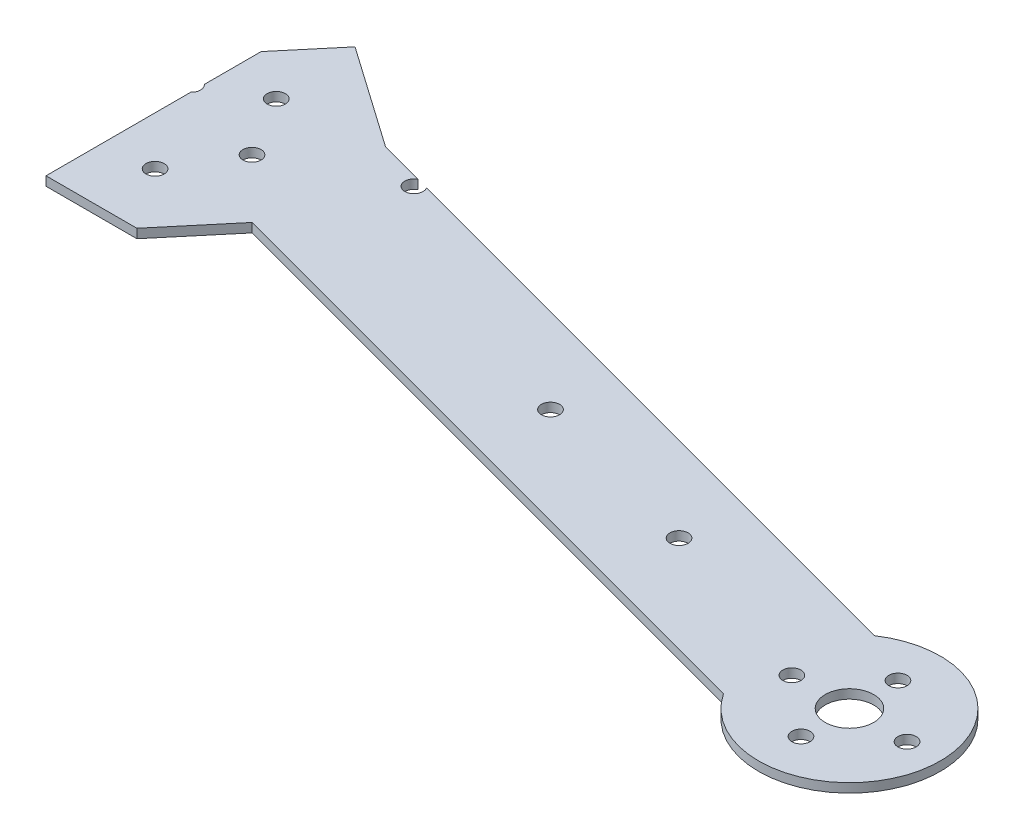
ISO-10303-21;
HEADER;
FILE_DESCRIPTION(('STEP AP214'),'2;1');
FILE_NAME('part.step','',(''),(''),'','','');
FILE_SCHEMA(('AUTOMOTIVE_DESIGN { 1 0 10303 214 1 1 1 1 }'));
ENDSEC;
DATA;
#1=APPLICATION_CONTEXT('core data for automotive mechanical design processes');
#2=APPLICATION_PROTOCOL_DEFINITION('international standard','automotive_design',2000,#1);
#3=PRODUCT_CONTEXT('',#1,'mechanical');
#4=PRODUCT('Part','Part','',(#3));
#5=PRODUCT_RELATED_PRODUCT_CATEGORY('part','',(#4));
#6=PRODUCT_DEFINITION_FORMATION('','',#4);
#7=PRODUCT_DEFINITION_CONTEXT('part definition',#1,'design');
#8=PRODUCT_DEFINITION('design','',#6,#7);
#9=PRODUCT_DEFINITION_SHAPE('','',#8);
#10=(LENGTH_UNIT() NAMED_UNIT(*) SI_UNIT(.MILLI.,.METRE.));
#11=(NAMED_UNIT(*) PLANE_ANGLE_UNIT() SI_UNIT($,.RADIAN.));
#12=(NAMED_UNIT(*) SI_UNIT($,.STERADIAN.) SOLID_ANGLE_UNIT());
#13=UNCERTAINTY_MEASURE_WITH_UNIT(LENGTH_MEASURE(1.E-05),#10,'distance_accuracy_value','');
#14=(GEOMETRIC_REPRESENTATION_CONTEXT(3) GLOBAL_UNCERTAINTY_ASSIGNED_CONTEXT((#13)) GLOBAL_UNIT_ASSIGNED_CONTEXT((#10,
#11,#12)) REPRESENTATION_CONTEXT('',''));
#15=CARTESIAN_POINT('',(0.,0.,0.));
#16=DIRECTION('',(0.,0.,1.));
#17=DIRECTION('',(1.,0.,0.));
#18=AXIS2_PLACEMENT_3D('',#15,#16,#17);
#19=CARTESIAN_POINT('',(23.8632806144762,1.5,38.5929556029831));
#20=DIRECTION('',(0.258773909128812,0.,-0.965937919306512));
#21=DIRECTION('',(-0.965937919306512,0.,-0.258773909128812));
#22=AXIS2_PLACEMENT_3D('',#19,#20,#21);
#23=PLANE('',#22);
#24=DIRECTION('',(0.,1.,0.));
#25=VECTOR('',#24,1.);
#26=CARTESIAN_POINT('',(31.1943125351646,-4.24264068711929,40.5569325316729));
#27=LINE('',#26,#25);
#28=CARTESIAN_POINT('',(31.1943125351646,0.,40.5569325316729));
#29=VERTEX_POINT('',#28);
#30=CARTESIAN_POINT('',(31.1943125351646,1.5,40.5569325316729));
#31=VERTEX_POINT('',#30);
#32=EDGE_CURVE('E12',#29,#31,#27,.T.);
#33=ORIENTED_EDGE('',*,*,#32,.F.);
#34=DIRECTION('',(0.965937919306512,0.,0.258773909128812));
#35=VECTOR('',#34,1.);
#36=CARTESIAN_POINT('',(23.8632806144762,0.,38.5929556029831));
#37=LINE('',#36,#35);
#38=CARTESIAN_POINT('',(23.8632806144762,0.,38.5929556029831));
#39=VERTEX_POINT('',#38);
#40=EDGE_CURVE('E405',#39,#29,#37,.T.);
#41=ORIENTED_EDGE('',*,*,#40,.F.);
#42=DIRECTION('',(0.,-1.,0.));
#43=VECTOR('',#42,1.);
#44=CARTESIAN_POINT('',(23.8632806144762,1.5,38.5929556029831));
#45=LINE('',#44,#43);
#46=CARTESIAN_POINT('',(23.8632806144762,1.5,38.5929556029831));
#47=VERTEX_POINT('',#46);
#48=EDGE_CURVE('E399',#47,#39,#45,.T.);
#49=ORIENTED_EDGE('',*,*,#48,.F.);
#50=DIRECTION('',(0.965937919306512,0.,0.258773909128812));
#51=VECTOR('',#50,1.);
#52=CARTESIAN_POINT('',(23.8632806144762,1.5,38.5929556029831));
#53=LINE('',#52,#51);
#54=EDGE_CURVE('E403',#47,#31,#53,.T.);
#55=ORIENTED_EDGE('',*,*,#54,.T.);
#56=EDGE_LOOP('',(#33,#41,#49,#55));
#57=FACE_BOUND('',#56,.T.);
#58=ADVANCED_FACE('F305',(#57),#23,.T.);
#59=CARTESIAN_POINT('',(-0.999999999999998,1.5,45.7611275320955));
#60=DIRECTION('',(0.,-1.,0.));
#61=DIRECTION('',(0.,0.,-1.));
#62=AXIS2_PLACEMENT_3D('',#59,#60,#61);
#63=PLANE('',#62);
#64=CARTESIAN_POINT('',(75.0359849925505,1.5,62.5434048954609));
#65=DIRECTION('',(0.,1.,0.));
#66=DIRECTION('',(0.,0.,1.));
#67=AXIS2_PLACEMENT_3D('',#64,#65,#66);
#68=CIRCLE('',#67,1.5);
#69=CARTESIAN_POINT('',(75.0359849925505,1.5,64.0434048954609));
#70=VERTEX_POINT('',#69);
#71=EDGE_CURVE('E581',#70,#70,#68,.T.);
#72=ORIENTED_EDGE('',*,*,#71,.F.);
#73=EDGE_LOOP('',(#72));
#74=FACE_BOUND('',#73,.T.);
#75=CARTESIAN_POINT('',(104.014122571746,1.5,70.3066221693253));
#76=DIRECTION('',(0.,1.,0.));
#77=DIRECTION('',(0.,0.,1.));
#78=AXIS2_PLACEMENT_3D('',#75,#76,#77);
#79=CIRCLE('',#78,1.5);
#80=CARTESIAN_POINT('',(104.014122571746,1.5,71.8066221693253));
#81=VERTEX_POINT('',#80);
#82=EDGE_CURVE('E589',#81,#81,#79,.T.);
#83=ORIENTED_EDGE('',*,*,#82,.F.);
#84=EDGE_LOOP('',(#83));
#85=FACE_BOUND('',#84,.T.);
#86=CARTESIAN_POINT('',(142.429473622566,1.5,80.5980605353781));
#87=DIRECTION('',(0.,-1.,0.));
#88=DIRECTION('',(0.,0.,-1.));
#89=AXIS2_PLACEMENT_3D('',#86,#87,#88);
#90=CIRCLE('',#89,3.99999999999999);
#91=CARTESIAN_POINT('',(142.429473622566,1.5,76.5980605353782));
#92=VERTEX_POINT('',#91);
#93=EDGE_CURVE('E536',#92,#92,#90,.T.);
#94=ORIENTED_EDGE('',*,*,#93,.T.);
#95=EDGE_LOOP('',(#94));
#96=FACE_BOUND('',#95,.T.);
#97=CARTESIAN_POINT('',(8.,1.5,60.7611275320955));
#98=DIRECTION('',(0.,-1.,0.));
#99=DIRECTION('',(0.,0.,-1.));
#100=AXIS2_PLACEMENT_3D('',#97,#98,#99);
#101=CIRCLE('',#100,1.5);
#102=CARTESIAN_POINT('',(8.,1.5,59.2611275320955));
#103=VERTEX_POINT('',#102);
#104=EDGE_CURVE('E528',#103,#103,#101,.T.);
#105=ORIENTED_EDGE('',*,*,#104,.T.);
#106=EDGE_LOOP('',(#105));
#107=FACE_BOUND('',#106,.T.);
#108=CARTESIAN_POINT('',(14.,1.5,50.7611275320955));
#109=DIRECTION('',(0.,-1.,0.));
#110=DIRECTION('',(0.,0.,-1.));
#111=AXIS2_PLACEMENT_3D('',#108,#109,#110);
#112=CIRCLE('',#111,1.5);
#113=CARTESIAN_POINT('',(14.,1.5,49.2611275320955));
#114=VERTEX_POINT('',#113);
#115=EDGE_CURVE('E520',#114,#114,#112,.T.);
#116=ORIENTED_EDGE('',*,*,#115,.T.);
#117=EDGE_LOOP('',(#116));
#118=FACE_BOUND('',#117,.T.);
#119=CARTESIAN_POINT('',(8.,1.5,40.7611275320955));
#120=DIRECTION('',(0.,-1.,0.));
#121=DIRECTION('',(0.,0.,-1.));
#122=AXIS2_PLACEMENT_3D('',#119,#120,#121);
#123=CIRCLE('',#122,1.5);
#124=CARTESIAN_POINT('',(8.,1.5,39.2611275320955));
#125=VERTEX_POINT('',#124);
#126=EDGE_CURVE('E436',#125,#125,#123,.T.);
#127=ORIENTED_EDGE('',*,*,#126,.T.);
#128=EDGE_LOOP('',(#127));
#129=FACE_BOUND('',#128,.T.);
#130=CARTESIAN_POINT('',(33.1085220639018,1.5,41.0697475612336));
#131=VERTEX_POINT('',#130);
#132=CARTESIAN_POINT('',(134.097880355283,1.5,68.1247067911532));
#133=VERTEX_POINT('',#132);
#134=EDGE_CURVE('E422',#131,#133,#53,.T.);
#135=ORIENTED_EDGE('',*,*,#134,.F.);
#136=CARTESIAN_POINT('',(31.86,1.5,41.9011275320955));
#137=DIRECTION('',(0.,1.,0.));
#138=DIRECTION('',(0.,0.,1.));
#139=AXIS2_PLACEMENT_3D('',#136,#137,#138);
#140=CIRCLE('',#139,1.5);
#141=EDGE_CURVE('E320',#31,#131,#140,.T.);
#142=ORIENTED_EDGE('',*,*,#141,.F.);
#143=ORIENTED_EDGE('',*,*,#54,.F.);
#144=DIRECTION('',(0.819152044288993,0.,0.573576436351045));
#145=VECTOR('',#144,1.);
#146=CARTESIAN_POINT('',(7.07066370655189,1.5,26.8346386577867));
#147=LINE('',#146,#145);
#148=CARTESIAN_POINT('',(7.07066370655189,1.5,26.8346386577867));
#149=VERTEX_POINT('',#148);
#150=EDGE_CURVE('E420',#149,#47,#147,.T.);
#151=ORIENTED_EDGE('',*,*,#150,.F.);
#152=DIRECTION('',(0.642787609686535,0.,-0.766044443118982));
#153=VECTOR('',#152,1.);
#154=CARTESIAN_POINT('',(0.,1.5,35.2611275320955));
#155=LINE('',#154,#153);
#156=CARTESIAN_POINT('',(0.,1.5,35.2611275320955));
#157=VERTEX_POINT('',#156);
#158=EDGE_CURVE('E426',#157,#149,#155,.T.);
#159=ORIENTED_EDGE('',*,*,#158,.F.);
#160=DIRECTION('',(0.,0.,1.));
#161=VECTOR('',#160,1.);
#162=CARTESIAN_POINT('',(0.,1.5,35.2611275320955));
#163=LINE('',#162,#161);
#164=CARTESIAN_POINT('',(0.,1.5,44.6430935433456));
#165=VERTEX_POINT('',#164);
#166=EDGE_CURVE('E466',#157,#165,#163,.T.);
#167=ORIENTED_EDGE('',*,*,#166,.T.);
#168=CARTESIAN_POINT('',(-0.999999999999998,1.5,45.7611275320955));
#169=DIRECTION('',(0.,-1.,0.));
#170=DIRECTION('',(0.,0.,-1.));
#171=AXIS2_PLACEMENT_3D('',#168,#169,#170);
#172=CIRCLE('',#171,1.5);
#173=CARTESIAN_POINT('',(0.,1.5,46.8791615208454));
#174=VERTEX_POINT('',#173);
#175=EDGE_CURVE('E375',#165,#174,#172,.T.);
#176=ORIENTED_EDGE('',*,*,#175,.T.);
#177=DIRECTION('',(0.,0.,1.));
#178=VECTOR('',#177,1.);
#179=CARTESIAN_POINT('',(0.,1.5,46.8791615208454));
#180=LINE('',#179,#178);
#181=CARTESIAN_POINT('',(0.,1.5,70.7611275320955));
#182=VERTEX_POINT('',#181);
#183=EDGE_CURVE('E600',#174,#182,#180,.T.);
#184=ORIENTED_EDGE('',*,*,#183,.T.);
#185=DIRECTION('',(1.,0.,0.));
#186=VECTOR('',#185,1.);
#187=CARTESIAN_POINT('',(0.,1.5,70.7611275320955));
#188=LINE('',#187,#186);
#189=CARTESIAN_POINT('',(15.,1.5,70.7611275320955));
#190=VERTEX_POINT('',#189);
#191=EDGE_CURVE('E603',#182,#190,#188,.T.);
#192=ORIENTED_EDGE('',*,*,#191,.T.);
#193=DIRECTION('',(0.642787609686538,0.,-0.766044443118979));
#194=VECTOR('',#193,1.);
#195=CARTESIAN_POINT('',(15.,1.5,70.7611275320955));
#196=LINE('',#195,#194);
#197=CARTESIAN_POINT('',(23.6776327307683,1.5,60.4195275499893));
#198=VERTEX_POINT('',#197);
#199=EDGE_CURVE('E606',#190,#198,#196,.T.);
#200=ORIENTED_EDGE('',*,*,#199,.T.);
#201=DIRECTION('',(0.965925826289068,0.,0.258819045102521));
#202=VECTOR('',#201,1.);
#203=CARTESIAN_POINT('',(23.6776327307683,1.5,60.4195275499893));
#204=LINE('',#203,#202);
#205=CARTESIAN_POINT('',(129.929473622566,1.5,88.8896225112666));
#206=VERTEX_POINT('',#205);
#207=EDGE_CURVE('E609',#198,#206,#204,.T.);
#208=ORIENTED_EDGE('',*,*,#207,.T.);
#209=CARTESIAN_POINT('',(142.429473622566,1.5,80.5980605353781));
#210=DIRECTION('',(0.,-1.,0.));
#211=DIRECTION('',(0.,0.,-1.));
#212=AXIS2_PLACEMENT_3D('',#209,#210,#211);
#213=CIRCLE('',#212,15.);
#214=EDGE_CURVE('E611',#133,#206,#213,.T.);
#215=ORIENTED_EDGE('',*,*,#214,.F.);
#216=EDGE_LOOP('',(#135,#142,#143,#151,#159,#167,#176,#184,#192,#200,#208,#215));
#217=FACE_BOUND('',#216,.T.);
#218=CARTESIAN_POINT('',(132.929473622566,1.5,80.5980605353781));
#219=DIRECTION('',(0.,1.,0.));
#220=DIRECTION('',(0.,0.,1.));
#221=AXIS2_PLACEMENT_3D('',#218,#219,#220);
#222=CIRCLE('',#221,1.5);
#223=CARTESIAN_POINT('',(132.929473622566,1.5,82.0980605353781));
#224=VERTEX_POINT('',#223);
#225=EDGE_CURVE('E544',#224,#224,#222,.T.);
#226=ORIENTED_EDGE('',*,*,#225,.F.);
#227=EDGE_LOOP('',(#226));
#228=FACE_BOUND('',#227,.T.);
#229=CARTESIAN_POINT('',(142.429473622566,1.5,88.5980605353781));
#230=DIRECTION('',(0.,1.,0.));
#231=DIRECTION('',(0.,0.,1.));
#232=AXIS2_PLACEMENT_3D('',#229,#230,#231);
#233=CIRCLE('',#232,1.5);
#234=CARTESIAN_POINT('',(142.429473622566,1.5,90.0980605353781));
#235=VERTEX_POINT('',#234);
#236=EDGE_CURVE('E552',#235,#235,#233,.T.);
#237=ORIENTED_EDGE('',*,*,#236,.F.);
#238=EDGE_LOOP('',(#237));
#239=FACE_BOUND('',#238,.T.);
#240=CARTESIAN_POINT('',(151.929473622566,1.5,80.5980605353781));
#241=DIRECTION('',(0.,1.,0.));
#242=DIRECTION('',(0.,0.,1.));
#243=AXIS2_PLACEMENT_3D('',#240,#241,#242);
#244=CIRCLE('',#243,1.5);
#245=CARTESIAN_POINT('',(151.929473622566,1.5,82.0980605353781));
#246=VERTEX_POINT('',#245);
#247=EDGE_CURVE('E560',#246,#246,#244,.T.);
#248=ORIENTED_EDGE('',*,*,#247,.F.);
#249=EDGE_LOOP('',(#248));
#250=FACE_BOUND('',#249,.T.);
#251=CARTESIAN_POINT('',(142.429473622566,1.5,72.5980605353782));
#252=DIRECTION('',(0.,1.,0.));
#253=DIRECTION('',(0.,0.,1.));
#254=AXIS2_PLACEMENT_3D('',#251,#252,#253);
#255=CIRCLE('',#254,1.5);
#256=CARTESIAN_POINT('',(142.429473622566,1.5,74.0980605353782));
#257=VERTEX_POINT('',#256);
#258=EDGE_CURVE('E568',#257,#257,#255,.T.);
#259=ORIENTED_EDGE('',*,*,#258,.F.);
#260=EDGE_LOOP('',(#259));
#261=FACE_BOUND('',#260,.T.);
#262=ADVANCED_FACE('F417',(#74,#85,#96,#107,#118,#129,#217,#228,#239,#250,#261),#63,.F.);
#263=CARTESIAN_POINT('',(-0.999999999999998,0.,45.7611275320955));
#264=DIRECTION('',(0.,-1.,0.));
#265=DIRECTION('',(0.,0.,-1.));
#266=AXIS2_PLACEMENT_3D('',#263,#264,#265);
#267=PLANE('',#266);
#268=CARTESIAN_POINT('',(75.0359849925505,0.,62.5434048954609));
#269=DIRECTION('',(0.,-1.,0.));
#270=DIRECTION('',(0.,0.,-1.));
#271=AXIS2_PLACEMENT_3D('',#268,#269,#270);
#272=CIRCLE('',#271,1.5);
#273=CARTESIAN_POINT('',(75.0359849925505,0.,61.0434048954609));
#274=VERTEX_POINT('',#273);
#275=EDGE_CURVE('E577',#274,#274,#272,.F.);
#276=ORIENTED_EDGE('',*,*,#275,.T.);
#277=EDGE_LOOP('',(#276));
#278=FACE_BOUND('',#277,.T.);
#279=CARTESIAN_POINT('',(104.014122571746,0.,70.3066221693253));
#280=DIRECTION('',(0.,-1.,0.));
#281=DIRECTION('',(0.,0.,-1.));
#282=AXIS2_PLACEMENT_3D('',#279,#280,#281);
#283=CIRCLE('',#282,1.5);
#284=CARTESIAN_POINT('',(104.014122571746,0.,68.8066221693253));
#285=VERTEX_POINT('',#284);
#286=EDGE_CURVE('E585',#285,#285,#283,.F.);
#287=ORIENTED_EDGE('',*,*,#286,.T.);
#288=EDGE_LOOP('',(#287));
#289=FACE_BOUND('',#288,.T.);
#290=CARTESIAN_POINT('',(31.86,0.,41.9011275320955));
#291=DIRECTION('',(0.,-1.,0.));
#292=DIRECTION('',(0.,0.,-1.));
#293=AXIS2_PLACEMENT_3D('',#290,#291,#292);
#294=CIRCLE('',#293,1.5);
#295=CARTESIAN_POINT('',(33.1085220639019,0.,41.0697475612336));
#296=VERTEX_POINT('',#295);
#297=EDGE_CURVE('E500',#29,#296,#294,.F.);
#298=ORIENTED_EDGE('',*,*,#297,.T.);
#299=CARTESIAN_POINT('',(134.097880355283,0.,68.1247067911532));
#300=VERTEX_POINT('',#299);
#301=EDGE_CURVE('E456',#296,#300,#37,.T.);
#302=ORIENTED_EDGE('',*,*,#301,.T.);
#303=CARTESIAN_POINT('',(142.429473622566,0.,80.5980605353781));
#304=DIRECTION('',(0.,-1.,0.));
#305=DIRECTION('',(0.,0.,-1.));
#306=AXIS2_PLACEMENT_3D('',#303,#304,#305);
#307=CIRCLE('',#306,15.);
#308=CARTESIAN_POINT('',(129.929473622566,0.,88.8896225112666));
#309=VERTEX_POINT('',#308);
#310=EDGE_CURVE('E452',#300,#309,#307,.T.);
#311=ORIENTED_EDGE('',*,*,#310,.T.);
#312=DIRECTION('',(0.965925826289068,0.,0.258819045102521));
#313=VECTOR('',#312,1.);
#314=CARTESIAN_POINT('',(23.6776327307683,0.,60.4195275499893));
#315=LINE('',#314,#313);
#316=CARTESIAN_POINT('',(23.6776327307683,0.,60.4195275499893));
#317=VERTEX_POINT('',#316);
#318=EDGE_CURVE('E448',#317,#309,#315,.T.);
#319=ORIENTED_EDGE('',*,*,#318,.F.);
#320=DIRECTION('',(0.642787609686538,0.,-0.766044443118979));
#321=VECTOR('',#320,1.);
#322=CARTESIAN_POINT('',(15.,0.,70.7611275320955));
#323=LINE('',#322,#321);
#324=CARTESIAN_POINT('',(15.,0.,70.7611275320955));
#325=VERTEX_POINT('',#324);
#326=EDGE_CURVE('E445',#325,#317,#323,.T.);
#327=ORIENTED_EDGE('',*,*,#326,.F.);
#328=DIRECTION('',(1.,0.,0.));
#329=VECTOR('',#328,1.);
#330=CARTESIAN_POINT('',(0.,0.,70.7611275320955));
#331=LINE('',#330,#329);
#332=CARTESIAN_POINT('',(0.,0.,70.7611275320955));
#333=VERTEX_POINT('',#332);
#334=EDGE_CURVE('E442',#333,#325,#331,.T.);
#335=ORIENTED_EDGE('',*,*,#334,.F.);
#336=DIRECTION('',(0.,0.,1.));
#337=VECTOR('',#336,1.);
#338=CARTESIAN_POINT('',(0.,0.,46.8791615208454));
#339=LINE('',#338,#337);
#340=CARTESIAN_POINT('',(0.,0.,46.8791615208454));
#341=VERTEX_POINT('',#340);
#342=EDGE_CURVE('E439',#341,#333,#339,.T.);
#343=ORIENTED_EDGE('',*,*,#342,.F.);
#344=CARTESIAN_POINT('',(-0.999999999999998,0.,45.7611275320955));
#345=DIRECTION('',(0.,-1.,0.));
#346=DIRECTION('',(0.,0.,-1.));
#347=AXIS2_PLACEMENT_3D('',#344,#345,#346);
#348=CIRCLE('',#347,1.5);
#349=CARTESIAN_POINT('',(0.,0.,44.6430935433456));
#350=VERTEX_POINT('',#349);
#351=EDGE_CURVE('E435',#350,#341,#348,.T.);
#352=ORIENTED_EDGE('',*,*,#351,.F.);
#353=DIRECTION('',(0.,0.,1.));
#354=VECTOR('',#353,1.);
#355=CARTESIAN_POINT('',(0.,0.,35.2611275320955));
#356=LINE('',#355,#354);
#357=CARTESIAN_POINT('',(0.,0.,35.2611275320955));
#358=VERTEX_POINT('',#357);
#359=EDGE_CURVE('E432',#358,#350,#356,.T.);
#360=ORIENTED_EDGE('',*,*,#359,.F.);
#361=DIRECTION('',(0.642787609686535,0.,-0.766044443118982));
#362=VECTOR('',#361,1.);
#363=CARTESIAN_POINT('',(0.,0.,35.2611275320955));
#364=LINE('',#363,#362);
#365=CARTESIAN_POINT('',(7.07066370655189,0.,26.8346386577867));
#366=VERTEX_POINT('',#365);
#367=EDGE_CURVE('E462',#358,#366,#364,.T.);
#368=ORIENTED_EDGE('',*,*,#367,.T.);
#369=DIRECTION('',(0.819152044288993,0.,0.573576436351045));
#370=VECTOR('',#369,1.);
#371=CARTESIAN_POINT('',(7.07066370655189,0.,26.8346386577867));
#372=LINE('',#371,#370);
#373=EDGE_CURVE('E459',#366,#39,#372,.T.);
#374=ORIENTED_EDGE('',*,*,#373,.T.);
#375=ORIENTED_EDGE('',*,*,#40,.T.);
#376=EDGE_LOOP('',(#298,#302,#311,#319,#327,#335,#343,#352,#360,#368,#374,#375));
#377=FACE_BOUND('',#376,.T.);
#378=CARTESIAN_POINT('',(151.929473622566,0.,80.5980605353781));
#379=DIRECTION('',(0.,1.,0.));
#380=DIRECTION('',(0.,0.,1.));
#381=AXIS2_PLACEMENT_3D('',#378,#379,#380);
#382=CIRCLE('',#381,1.5);
#383=CARTESIAN_POINT('',(151.929473622566,0.,82.0980605353781));
#384=VERTEX_POINT('',#383);
#385=EDGE_CURVE('E564',#384,#384,#382,.T.);
#386=ORIENTED_EDGE('',*,*,#385,.T.);
#387=EDGE_LOOP('',(#386));
#388=FACE_BOUND('',#387,.T.);
#389=CARTESIAN_POINT('',(132.929473622566,0.,80.5980605353781));
#390=DIRECTION('',(0.,1.,0.));
#391=DIRECTION('',(0.,0.,1.));
#392=AXIS2_PLACEMENT_3D('',#389,#390,#391);
#393=CIRCLE('',#392,1.5);
#394=CARTESIAN_POINT('',(132.929473622566,0.,82.0980605353781));
#395=VERTEX_POINT('',#394);
#396=EDGE_CURVE('E548',#395,#395,#393,.T.);
#397=ORIENTED_EDGE('',*,*,#396,.T.);
#398=EDGE_LOOP('',(#397));
#399=FACE_BOUND('',#398,.T.);
#400=CARTESIAN_POINT('',(142.429473622566,0.,80.5980605353781));
#401=DIRECTION('',(0.,-1.,0.));
#402=DIRECTION('',(0.,0.,-1.));
#403=AXIS2_PLACEMENT_3D('',#400,#401,#402);
#404=CIRCLE('',#403,3.99999999999999);
#405=CARTESIAN_POINT('',(142.429473622566,0.,76.5980605353782));
#406=VERTEX_POINT('',#405);
#407=EDGE_CURVE('E540',#406,#406,#404,.T.);
#408=ORIENTED_EDGE('',*,*,#407,.F.);
#409=EDGE_LOOP('',(#408));
#410=FACE_BOUND('',#409,.T.);
#411=CARTESIAN_POINT('',(8.,0.,60.7611275320955));
#412=DIRECTION('',(0.,-1.,0.));
#413=DIRECTION('',(0.,0.,-1.));
#414=AXIS2_PLACEMENT_3D('',#411,#412,#413);
#415=CIRCLE('',#414,1.5);
#416=CARTESIAN_POINT('',(8.,0.,59.2611275320955));
#417=VERTEX_POINT('',#416);
#418=EDGE_CURVE('E532',#417,#417,#415,.T.);
#419=ORIENTED_EDGE('',*,*,#418,.F.);
#420=EDGE_LOOP('',(#419));
#421=FACE_BOUND('',#420,.T.);
#422=CARTESIAN_POINT('',(14.,0.,50.7611275320955));
#423=DIRECTION('',(0.,-1.,0.));
#424=DIRECTION('',(0.,0.,-1.));
#425=AXIS2_PLACEMENT_3D('',#422,#423,#424);
#426=CIRCLE('',#425,1.5);
#427=CARTESIAN_POINT('',(14.,0.,49.2611275320955));
#428=VERTEX_POINT('',#427);
#429=EDGE_CURVE('E524',#428,#428,#426,.T.);
#430=ORIENTED_EDGE('',*,*,#429,.F.);
#431=EDGE_LOOP('',(#430));
#432=FACE_BOUND('',#431,.T.);
#433=CARTESIAN_POINT('',(8.,0.,40.7611275320955));
#434=DIRECTION('',(0.,-1.,0.));
#435=DIRECTION('',(0.,0.,-1.));
#436=AXIS2_PLACEMENT_3D('',#433,#434,#435);
#437=CIRCLE('',#436,1.5);
#438=CARTESIAN_POINT('',(8.,0.,39.2611275320955));
#439=VERTEX_POINT('',#438);
#440=EDGE_CURVE('E516',#439,#439,#437,.T.);
#441=ORIENTED_EDGE('',*,*,#440,.F.);
#442=EDGE_LOOP('',(#441));
#443=FACE_BOUND('',#442,.T.);
#444=CARTESIAN_POINT('',(142.429473622566,0.,88.5980605353781));
#445=DIRECTION('',(0.,1.,0.));
#446=DIRECTION('',(0.,0.,1.));
#447=AXIS2_PLACEMENT_3D('',#444,#445,#446);
#448=CIRCLE('',#447,1.5);
#449=CARTESIAN_POINT('',(142.429473622566,0.,90.0980605353781));
#450=VERTEX_POINT('',#449);
#451=EDGE_CURVE('E556',#450,#450,#448,.T.);
#452=ORIENTED_EDGE('',*,*,#451,.T.);
#453=EDGE_LOOP('',(#452));
#454=FACE_BOUND('',#453,.T.);
#455=CARTESIAN_POINT('',(142.429473622566,0.,72.5980605353782));
#456=DIRECTION('',(0.,1.,0.));
#457=DIRECTION('',(0.,0.,1.));
#458=AXIS2_PLACEMENT_3D('',#455,#456,#457);
#459=CIRCLE('',#458,1.5);
#460=CARTESIAN_POINT('',(142.429473622566,0.,74.0980605353782));
#461=VERTEX_POINT('',#460);
#462=EDGE_CURVE('E507',#461,#461,#459,.T.);
#463=ORIENTED_EDGE('',*,*,#462,.T.);
#464=EDGE_LOOP('',(#463));
#465=FACE_BOUND('',#464,.T.);
#466=ADVANCED_FACE('F504',(#278,#289,#377,#388,#399,#410,#421,#432,#443,#454,#465),#267,.T.);
#467=CARTESIAN_POINT('',(0.,1.5,35.2611275320955));
#468=DIRECTION('',(1.,0.,0.));
#469=DIRECTION('',(0.,0.,-1.));
#470=AXIS2_PLACEMENT_3D('',#467,#468,#469);
#471=PLANE('',#470);
#472=ORIENTED_EDGE('',*,*,#359,.T.);
#473=DIRECTION('',(0.,-1.,0.));
#474=VECTOR('',#473,1.);
#475=CARTESIAN_POINT('',(0.,1.5,44.6430935433456));
#476=LINE('',#475,#474);
#477=EDGE_CURVE('E493',#165,#350,#476,.T.);
#478=ORIENTED_EDGE('',*,*,#477,.F.);
#479=ORIENTED_EDGE('',*,*,#166,.F.);
#480=DIRECTION('',(0.,-1.,0.));
#481=VECTOR('',#480,1.);
#482=CARTESIAN_POINT('',(0.,1.5,35.2611275320955));
#483=LINE('',#482,#481);
#484=EDGE_CURVE('E329',#157,#358,#483,.T.);
#485=ORIENTED_EDGE('',*,*,#484,.T.);
#486=EDGE_LOOP('',(#472,#478,#479,#485));
#487=FACE_BOUND('',#486,.T.);
#488=ADVANCED_FACE('F307',(#487),#471,.F.);
#489=CARTESIAN_POINT('',(-0.999999999999998,1.5,45.7611275320955));
#490=DIRECTION('',(0.,-1.,0.));
#491=DIRECTION('',(0.,0.,-1.));
#492=AXIS2_PLACEMENT_3D('',#489,#490,#491);
#493=CYLINDRICAL_SURFACE('',#492,1.5);
#494=ORIENTED_EDGE('',*,*,#351,.T.);
#495=DIRECTION('',(0.,-1.,0.));
#496=VECTOR('',#495,1.);
#497=CARTESIAN_POINT('',(0.,1.5,46.8791615208454));
#498=LINE('',#497,#496);
#499=EDGE_CURVE('E489',#174,#341,#498,.T.);
#500=ORIENTED_EDGE('',*,*,#499,.F.);
#501=ORIENTED_EDGE('',*,*,#175,.F.);
#502=ORIENTED_EDGE('',*,*,#477,.T.);
#503=EDGE_LOOP('',(#494,#500,#501,#502));
#504=FACE_BOUND('',#503,.T.);
#505=ADVANCED_FACE('F639',(#504),#493,.F.);
#506=CARTESIAN_POINT('',(0.,1.5,46.8791615208454));
#507=DIRECTION('',(1.,0.,0.));
#508=DIRECTION('',(0.,0.,-1.));
#509=AXIS2_PLACEMENT_3D('',#506,#507,#508);
#510=PLANE('',#509);
#511=ORIENTED_EDGE('',*,*,#342,.T.);
#512=DIRECTION('',(0.,-1.,0.));
#513=VECTOR('',#512,1.);
#514=CARTESIAN_POINT('',(0.,1.5,70.7611275320955));
#515=LINE('',#514,#513);
#516=EDGE_CURVE('E485',#182,#333,#515,.T.);
#517=ORIENTED_EDGE('',*,*,#516,.F.);
#518=ORIENTED_EDGE('',*,*,#183,.F.);
#519=ORIENTED_EDGE('',*,*,#499,.T.);
#520=EDGE_LOOP('',(#511,#517,#518,#519));
#521=FACE_BOUND('',#520,.T.);
#522=ADVANCED_FACE('F637',(#521),#510,.F.);
#523=CARTESIAN_POINT('',(0.,1.5,70.7611275320955));
#524=DIRECTION('',(0.,0.,-1.));
#525=DIRECTION('',(-1.,0.,0.));
#526=AXIS2_PLACEMENT_3D('',#523,#524,#525);
#527=PLANE('',#526);
#528=ORIENTED_EDGE('',*,*,#334,.T.);
#529=DIRECTION('',(0.,-1.,0.));
#530=VECTOR('',#529,1.);
#531=CARTESIAN_POINT('',(15.,1.5,70.7611275320955));
#532=LINE('',#531,#530);
#533=EDGE_CURVE('E481',#190,#325,#532,.T.);
#534=ORIENTED_EDGE('',*,*,#533,.F.);
#535=ORIENTED_EDGE('',*,*,#191,.F.);
#536=ORIENTED_EDGE('',*,*,#516,.T.);
#537=EDGE_LOOP('',(#528,#534,#535,#536));
#538=FACE_BOUND('',#537,.T.);
#539=ADVANCED_FACE('F633',(#538),#527,.F.);
#540=CARTESIAN_POINT('',(15.,1.5,70.7611275320955));
#541=DIRECTION('',(-0.766044443118979,0.,-0.642787609686538));
#542=DIRECTION('',(-0.642787609686538,0.,0.766044443118979));
#543=AXIS2_PLACEMENT_3D('',#540,#541,#542);
#544=PLANE('',#543);
#545=ORIENTED_EDGE('',*,*,#326,.T.);
#546=DIRECTION('',(0.,-1.,0.));
#547=VECTOR('',#546,1.);
#548=CARTESIAN_POINT('',(23.6776327307683,1.5,60.4195275499893));
#549=LINE('',#548,#547);
#550=EDGE_CURVE('E477',#198,#317,#549,.T.);
#551=ORIENTED_EDGE('',*,*,#550,.F.);
#552=ORIENTED_EDGE('',*,*,#199,.F.);
#553=ORIENTED_EDGE('',*,*,#533,.T.);
#554=EDGE_LOOP('',(#545,#551,#552,#553));
#555=FACE_BOUND('',#554,.T.);
#556=ADVANCED_FACE('F629',(#555),#544,.F.);
#557=CARTESIAN_POINT('',(23.6776327307683,1.5,60.4195275499893));
#558=DIRECTION('',(0.258819045102521,0.,-0.965925826289068));
#559=DIRECTION('',(-0.965925826289068,0.,-0.258819045102521));
#560=AXIS2_PLACEMENT_3D('',#557,#558,#559);
#561=PLANE('',#560);
#562=ORIENTED_EDGE('',*,*,#318,.T.);
#563=DIRECTION('',(0.,-1.,0.));
#564=VECTOR('',#563,1.);
#565=CARTESIAN_POINT('',(129.929473622566,1.5,88.8896225112666));
#566=LINE('',#565,#564);
#567=EDGE_CURVE('E474',#206,#309,#566,.T.);
#568=ORIENTED_EDGE('',*,*,#567,.F.);
#569=ORIENTED_EDGE('',*,*,#207,.F.);
#570=ORIENTED_EDGE('',*,*,#550,.T.);
#571=EDGE_LOOP('',(#562,#568,#569,#570));
#572=FACE_BOUND('',#571,.T.);
#573=ADVANCED_FACE('F623',(#572),#561,.F.);
#574=CARTESIAN_POINT('',(142.429473622566,1.5,80.5980605353781));
#575=DIRECTION('',(0.,-1.,0.));
#576=DIRECTION('',(0.,0.,-1.));
#577=AXIS2_PLACEMENT_3D('',#574,#575,#576);
#578=CYLINDRICAL_SURFACE('',#577,15.);
#579=ORIENTED_EDGE('',*,*,#310,.F.);
#580=DIRECTION('',(0.,-1.,0.));
#581=VECTOR('',#580,1.);
#582=CARTESIAN_POINT('',(134.097880355283,1.5,68.1247067911532));
#583=LINE('',#582,#581);
#584=EDGE_CURVE('E411',#133,#300,#583,.T.);
#585=ORIENTED_EDGE('',*,*,#584,.F.);
#586=ORIENTED_EDGE('',*,*,#214,.T.);
#587=ORIENTED_EDGE('',*,*,#567,.T.);
#588=EDGE_LOOP('',(#579,#585,#586,#587));
#589=FACE_BOUND('',#588,.T.);
#590=ADVANCED_FACE('F617',(#589),#578,.T.);
#591=DIRECTION('',(0.,1.,0.));
#592=VECTOR('',#591,1.);
#593=CARTESIAN_POINT('',(33.1085220639018,-4.24264068711929,41.0697475612336));
#594=LINE('',#593,#592);
#595=EDGE_CURVE('E314',#131,#296,#594,.F.);
#596=ORIENTED_EDGE('',*,*,#595,.F.);
#597=ORIENTED_EDGE('',*,*,#134,.T.);
#598=ORIENTED_EDGE('',*,*,#584,.T.);
#599=ORIENTED_EDGE('',*,*,#301,.F.);
#600=EDGE_LOOP('',(#596,#597,#598,#599));
#601=FACE_BOUND('',#600,.T.);
#602=ADVANCED_FACE('F509',(#601),#23,.T.);
#603=CARTESIAN_POINT('',(7.07066370655189,1.5,26.8346386577867));
#604=DIRECTION('',(0.573576436351045,0.,-0.819152044288993));
#605=DIRECTION('',(-0.819152044288993,0.,-0.573576436351045));
#606=AXIS2_PLACEMENT_3D('',#603,#604,#605);
#607=PLANE('',#606);
#608=ORIENTED_EDGE('',*,*,#373,.F.);
#609=DIRECTION('',(0.,-1.,0.));
#610=VECTOR('',#609,1.);
#611=CARTESIAN_POINT('',(7.07066370655189,1.5,26.8346386577867));
#612=LINE('',#611,#610);
#613=EDGE_CURVE('E412',#149,#366,#612,.T.);
#614=ORIENTED_EDGE('',*,*,#613,.F.);
#615=ORIENTED_EDGE('',*,*,#150,.T.);
#616=ORIENTED_EDGE('',*,*,#48,.T.);
#617=EDGE_LOOP('',(#608,#614,#615,#616));
#618=FACE_BOUND('',#617,.T.);
#619=ADVANCED_FACE('F424',(#618),#607,.T.);
#620=CARTESIAN_POINT('',(0.,1.5,35.2611275320955));
#621=DIRECTION('',(-0.766044443118982,0.,-0.642787609686535));
#622=DIRECTION('',(-0.642787609686535,0.,0.766044443118982));
#623=AXIS2_PLACEMENT_3D('',#620,#621,#622);
#624=PLANE('',#623);
#625=ORIENTED_EDGE('',*,*,#367,.F.);
#626=ORIENTED_EDGE('',*,*,#484,.F.);
#627=ORIENTED_EDGE('',*,*,#158,.T.);
#628=ORIENTED_EDGE('',*,*,#613,.T.);
#629=EDGE_LOOP('',(#625,#626,#627,#628));
#630=FACE_BOUND('',#629,.T.);
#631=ADVANCED_FACE('F661',(#630),#624,.T.);
#632=CARTESIAN_POINT('',(8.,1.5,40.7611275320955));
#633=DIRECTION('',(0.,-1.,0.));
#634=DIRECTION('',(0.,0.,-1.));
#635=AXIS2_PLACEMENT_3D('',#632,#633,#634);
#636=CYLINDRICAL_SURFACE('',#635,1.5);
#637=ORIENTED_EDGE('',*,*,#126,.F.);
#638=EDGE_LOOP('',(#637));
#639=FACE_BOUND('',#638,.T.);
#640=ORIENTED_EDGE('',*,*,#440,.T.);
#641=EDGE_LOOP('',(#640));
#642=FACE_BOUND('',#641,.T.);
#643=ADVANCED_FACE('F708',(#639,#642),#636,.F.);
#644=CARTESIAN_POINT('',(14.,1.5,50.7611275320955));
#645=DIRECTION('',(0.,-1.,0.));
#646=DIRECTION('',(0.,0.,-1.));
#647=AXIS2_PLACEMENT_3D('',#644,#645,#646);
#648=CYLINDRICAL_SURFACE('',#647,1.5);
#649=ORIENTED_EDGE('',*,*,#115,.F.);
#650=EDGE_LOOP('',(#649));
#651=FACE_BOUND('',#650,.T.);
#652=ORIENTED_EDGE('',*,*,#429,.T.);
#653=EDGE_LOOP('',(#652));
#654=FACE_BOUND('',#653,.T.);
#655=ADVANCED_FACE('F717',(#651,#654),#648,.F.);
#656=CARTESIAN_POINT('',(8.,1.5,60.7611275320955));
#657=DIRECTION('',(0.,-1.,0.));
#658=DIRECTION('',(0.,0.,-1.));
#659=AXIS2_PLACEMENT_3D('',#656,#657,#658);
#660=CYLINDRICAL_SURFACE('',#659,1.5);
#661=ORIENTED_EDGE('',*,*,#104,.F.);
#662=EDGE_LOOP('',(#661));
#663=FACE_BOUND('',#662,.T.);
#664=ORIENTED_EDGE('',*,*,#418,.T.);
#665=EDGE_LOOP('',(#664));
#666=FACE_BOUND('',#665,.T.);
#667=ADVANCED_FACE('F727',(#663,#666),#660,.F.);
#668=CARTESIAN_POINT('',(142.429473622566,1.5,80.5980605353781));
#669=DIRECTION('',(0.,-1.,0.));
#670=DIRECTION('',(0.,0.,-1.));
#671=AXIS2_PLACEMENT_3D('',#668,#669,#670);
#672=CYLINDRICAL_SURFACE('',#671,3.99999999999999);
#673=ORIENTED_EDGE('',*,*,#93,.F.);
#674=EDGE_LOOP('',(#673));
#675=FACE_BOUND('',#674,.T.);
#676=ORIENTED_EDGE('',*,*,#407,.T.);
#677=EDGE_LOOP('',(#676));
#678=FACE_BOUND('',#677,.T.);
#679=ADVANCED_FACE('F737',(#675,#678),#672,.F.);
#680=CARTESIAN_POINT('',(132.929473622566,1.5,80.5980605353781));
#681=DIRECTION('',(0.,-1.,0.));
#682=DIRECTION('',(0.,0.,-1.));
#683=AXIS2_PLACEMENT_3D('',#680,#681,#682);
#684=CYLINDRICAL_SURFACE('',#683,1.5);
#685=ORIENTED_EDGE('',*,*,#225,.T.);
#686=EDGE_LOOP('',(#685));
#687=FACE_BOUND('',#686,.T.);
#688=ORIENTED_EDGE('',*,*,#396,.F.);
#689=EDGE_LOOP('',(#688));
#690=FACE_BOUND('',#689,.T.);
#691=ADVANCED_FACE('F747',(#687,#690),#684,.F.);
#692=CARTESIAN_POINT('',(142.429473622566,1.5,88.5980605353781));
#693=DIRECTION('',(0.,-1.,0.));
#694=DIRECTION('',(0.,0.,-1.));
#695=AXIS2_PLACEMENT_3D('',#692,#693,#694);
#696=CYLINDRICAL_SURFACE('',#695,1.5);
#697=ORIENTED_EDGE('',*,*,#236,.T.);
#698=EDGE_LOOP('',(#697));
#699=FACE_BOUND('',#698,.T.);
#700=ORIENTED_EDGE('',*,*,#451,.F.);
#701=EDGE_LOOP('',(#700));
#702=FACE_BOUND('',#701,.T.);
#703=ADVANCED_FACE('F757',(#699,#702),#696,.F.);
#704=CARTESIAN_POINT('',(151.929473622566,1.5,80.5980605353781));
#705=DIRECTION('',(0.,-1.,0.));
#706=DIRECTION('',(0.,0.,-1.));
#707=AXIS2_PLACEMENT_3D('',#704,#705,#706);
#708=CYLINDRICAL_SURFACE('',#707,1.5);
#709=ORIENTED_EDGE('',*,*,#247,.T.);
#710=EDGE_LOOP('',(#709));
#711=FACE_BOUND('',#710,.T.);
#712=ORIENTED_EDGE('',*,*,#385,.F.);
#713=EDGE_LOOP('',(#712));
#714=FACE_BOUND('',#713,.T.);
#715=ADVANCED_FACE('F767',(#711,#714),#708,.F.);
#716=CARTESIAN_POINT('',(142.429473622566,1.5,72.5980605353782));
#717=DIRECTION('',(0.,-1.,0.));
#718=DIRECTION('',(0.,0.,-1.));
#719=AXIS2_PLACEMENT_3D('',#716,#717,#718);
#720=CYLINDRICAL_SURFACE('',#719,1.5);
#721=ORIENTED_EDGE('',*,*,#258,.T.);
#722=EDGE_LOOP('',(#721));
#723=FACE_BOUND('',#722,.T.);
#724=ORIENTED_EDGE('',*,*,#462,.F.);
#725=EDGE_LOOP('',(#724));
#726=FACE_BOUND('',#725,.T.);
#727=ADVANCED_FACE('F777',(#723,#726),#720,.F.);
#728=CARTESIAN_POINT('',(31.86,-4.24264068711929,41.9011275320955));
#729=DIRECTION('',(0.,1.,0.));
#730=DIRECTION('',(0.,0.,1.));
#731=AXIS2_PLACEMENT_3D('',#728,#729,#730);
#732=CYLINDRICAL_SURFACE('',#731,1.5);
#733=ORIENTED_EDGE('',*,*,#32,.T.);
#734=ORIENTED_EDGE('',*,*,#141,.T.);
#735=ORIENTED_EDGE('',*,*,#595,.T.);
#736=ORIENTED_EDGE('',*,*,#297,.F.);
#737=EDGE_LOOP('',(#733,#734,#735,#736));
#738=FACE_BOUND('',#737,.T.);
#739=ADVANCED_FACE('F498',(#738),#732,.F.);
#740=CARTESIAN_POINT('',(104.014122571746,-4.24264068711929,70.3066221693253));
#741=DIRECTION('',(0.,1.,0.));
#742=DIRECTION('',(0.,0.,1.));
#743=AXIS2_PLACEMENT_3D('',#740,#741,#742);
#744=CYLINDRICAL_SURFACE('',#743,1.5);
#745=ORIENTED_EDGE('',*,*,#82,.T.);
#746=EDGE_LOOP('',(#745));
#747=FACE_BOUND('',#746,.T.);
#748=ORIENTED_EDGE('',*,*,#286,.F.);
#749=EDGE_LOOP('',(#748));
#750=FACE_BOUND('',#749,.T.);
#751=ADVANCED_FACE('F803',(#747,#750),#744,.F.);
#752=CARTESIAN_POINT('',(75.0359849925505,-4.24264068711929,62.5434048954609));
#753=DIRECTION('',(0.,1.,0.));
#754=DIRECTION('',(0.,0.,1.));
#755=AXIS2_PLACEMENT_3D('',#752,#753,#754);
#756=CYLINDRICAL_SURFACE('',#755,1.5);
#757=ORIENTED_EDGE('',*,*,#71,.T.);
#758=EDGE_LOOP('',(#757));
#759=FACE_BOUND('',#758,.T.);
#760=ORIENTED_EDGE('',*,*,#275,.F.);
#761=EDGE_LOOP('',(#760));
#762=FACE_BOUND('',#761,.T.);
#763=ADVANCED_FACE('F825',(#759,#762),#756,.F.);
#764=CLOSED_SHELL('',(#58,#262,#466,#488,#505,#522,#539,#556,#573,#590,#602,#619,#631,#643,#655,
#667,#679,#691,#703,#715,#727,#739,#751,#763));
#765=MANIFOLD_SOLID_BREP('B2',#764);
#766=ADVANCED_BREP_SHAPE_REPRESENTATION('',(#18,#765),#14);
#767=SHAPE_DEFINITION_REPRESENTATION(#9,#766);
ENDSEC;
END-ISO-10303-21;
